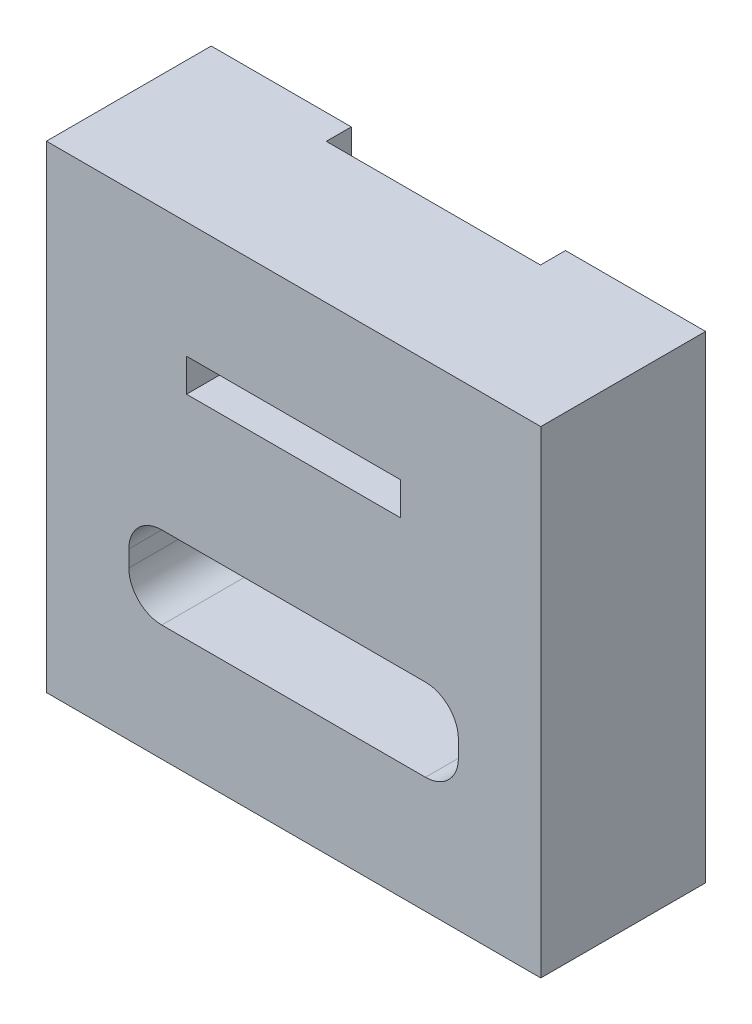
ISO-10303-21;
HEADER;
FILE_DESCRIPTION(('STEP AP214'),'2;1');
FILE_NAME('part.step','',(''),(''),'','','');
FILE_SCHEMA(('AUTOMOTIVE_DESIGN { 1 0 10303 214 1 1 1 1 }'));
ENDSEC;
DATA;
#1=APPLICATION_CONTEXT('core data for automotive mechanical design processes');
#2=APPLICATION_PROTOCOL_DEFINITION('international standard','automotive_design',2000,#1);
#3=PRODUCT_CONTEXT('',#1,'mechanical');
#4=PRODUCT('Part','Part','',(#3));
#5=PRODUCT_RELATED_PRODUCT_CATEGORY('part','',(#4));
#6=PRODUCT_DEFINITION_FORMATION('','',#4);
#7=PRODUCT_DEFINITION_CONTEXT('part definition',#1,'design');
#8=PRODUCT_DEFINITION('design','',#6,#7);
#9=PRODUCT_DEFINITION_SHAPE('','',#8);
#10=(LENGTH_UNIT() NAMED_UNIT(*) SI_UNIT(.MILLI.,.METRE.));
#11=(NAMED_UNIT(*) PLANE_ANGLE_UNIT() SI_UNIT($,.RADIAN.));
#12=(NAMED_UNIT(*) SI_UNIT($,.STERADIAN.) SOLID_ANGLE_UNIT());
#13=UNCERTAINTY_MEASURE_WITH_UNIT(LENGTH_MEASURE(1.E-05),#10,'distance_accuracy_value','');
#14=(GEOMETRIC_REPRESENTATION_CONTEXT(3) GLOBAL_UNCERTAINTY_ASSIGNED_CONTEXT((#13)) GLOBAL_UNIT_ASSIGNED_CONTEXT((#10,
#11,#12)) REPRESENTATION_CONTEXT('',''));
#15=CARTESIAN_POINT('',(0.,0.,0.));
#16=DIRECTION('',(0.,0.,1.));
#17=DIRECTION('',(1.,0.,0.));
#18=AXIS2_PLACEMENT_3D('',#15,#16,#17);
#19=CARTESIAN_POINT('',(0.,0.,10.));
#20=DIRECTION('',(0.,0.,1.));
#21=DIRECTION('',(1.,0.,0.));
#22=AXIS2_PLACEMENT_3D('',#19,#20,#21);
#23=PLANE('',#22);
#24=DIRECTION('',(0.,1.,0.));
#25=VECTOR('',#24,1.);
#26=CARTESIAN_POINT('',(18.3,-72.07,10.));
#27=LINE('',#26,#25);
#28=CARTESIAN_POINT('',(18.3,-101.05,10.));
#29=VERTEX_POINT('',#28);
#30=CARTESIAN_POINT('',(18.3,-72.07,10.));
#31=VERTEX_POINT('',#30);
#32=EDGE_CURVE('E244',#29,#31,#27,.T.);
#33=ORIENTED_EDGE('',*,*,#32,.T.);
#34=DIRECTION('',(-1.,0.,0.));
#35=VECTOR('',#34,1.);
#36=CARTESIAN_POINT('',(-11.7,-72.07,10.));
#37=LINE('',#36,#35);
#38=CARTESIAN_POINT('',(-11.7,-72.07,10.));
#39=VERTEX_POINT('',#38);
#40=EDGE_CURVE('E247',#31,#39,#37,.T.);
#41=ORIENTED_EDGE('',*,*,#40,.T.);
#42=DIRECTION('',(0.,-1.,0.));
#43=VECTOR('',#42,1.);
#44=CARTESIAN_POINT('',(-11.7,-72.07,10.));
#45=LINE('',#44,#43);
#46=CARTESIAN_POINT('',(-11.7,-101.05,10.));
#47=VERTEX_POINT('',#46);
#48=EDGE_CURVE('E250',#39,#47,#45,.T.);
#49=ORIENTED_EDGE('',*,*,#48,.T.);
#50=DIRECTION('',(1.,0.,0.));
#51=VECTOR('',#50,1.);
#52=CARTESIAN_POINT('',(-11.7,-101.05,10.));
#53=LINE('',#52,#51);
#54=EDGE_CURVE('E252',#47,#29,#53,.T.);
#55=ORIENTED_EDGE('',*,*,#54,.T.);
#56=EDGE_LOOP('',(#33,#41,#49,#55));
#57=FACE_BOUND('',#56,.T.);
#58=DIRECTION('',(0.,1.,0.));
#59=VECTOR('',#58,1.);
#60=CARTESIAN_POINT('',(9.80000000000001,-79.12,10.));
#61=LINE('',#60,#59);
#62=CARTESIAN_POINT('',(9.80000000000001,-81.12,10.));
#63=VERTEX_POINT('',#62);
#64=CARTESIAN_POINT('',(9.80000000000001,-79.12,10.));
#65=VERTEX_POINT('',#64);
#66=EDGE_CURVE('E222',#63,#65,#61,.T.);
#67=ORIENTED_EDGE('',*,*,#66,.F.);
#68=DIRECTION('',(1.,0.,0.));
#69=VECTOR('',#68,1.);
#70=CARTESIAN_POINT('',(9.80000000000001,-81.12,10.));
#71=LINE('',#70,#69);
#72=CARTESIAN_POINT('',(-3.19999999999999,-81.12,10.));
#73=VERTEX_POINT('',#72);
#74=EDGE_CURVE('E220',#73,#63,#71,.T.);
#75=ORIENTED_EDGE('',*,*,#74,.F.);
#76=DIRECTION('',(0.,-1.,0.));
#77=VECTOR('',#76,1.);
#78=CARTESIAN_POINT('',(-3.19999999999999,-81.12,10.));
#79=LINE('',#78,#77);
#80=CARTESIAN_POINT('',(-3.19999999999999,-79.12,10.));
#81=VERTEX_POINT('',#80);
#82=EDGE_CURVE('E227',#81,#73,#79,.T.);
#83=ORIENTED_EDGE('',*,*,#82,.F.);
#84=DIRECTION('',(-1.,0.,0.));
#85=VECTOR('',#84,1.);
#86=CARTESIAN_POINT('',(-3.19999999999999,-79.12,10.));
#87=LINE('',#86,#85);
#88=EDGE_CURVE('E224',#65,#81,#87,.T.);
#89=ORIENTED_EDGE('',*,*,#88,.F.);
#90=EDGE_LOOP('',(#67,#75,#83,#89));
#91=FACE_BOUND('',#90,.T.);
#92=DIRECTION('',(1.,0.,0.));
#93=VECTOR('',#92,1.);
#94=CARTESIAN_POINT('',(13.3,-94.,10.));
#95=LINE('',#94,#93);
#96=CARTESIAN_POINT('',(-4.69999999999999,-94.,10.));
#97=VERTEX_POINT('',#96);
#98=CARTESIAN_POINT('',(11.3,-94.,10.));
#99=VERTEX_POINT('',#98);
#100=EDGE_CURVE('E199',#97,#99,#95,.T.);
#101=ORIENTED_EDGE('',*,*,#100,.F.);
#102=CARTESIAN_POINT('',(-4.69999999999999,-92.,10.));
#103=DIRECTION('',(0.,0.,1.));
#104=DIRECTION('',(1.,0.,0.));
#105=AXIS2_PLACEMENT_3D('',#102,#103,#104);
#106=CIRCLE('',#105,2.);
#107=CARTESIAN_POINT('',(-6.69999999999999,-92.,10.));
#108=VERTEX_POINT('',#107);
#109=EDGE_CURVE('E308',#97,#108,#106,.F.);
#110=ORIENTED_EDGE('',*,*,#109,.T.);
#111=DIRECTION('',(0.,-1.,0.));
#112=VECTOR('',#111,1.);
#113=CARTESIAN_POINT('',(-6.69999999999999,-94.,10.));
#114=LINE('',#113,#112);
#115=CARTESIAN_POINT('',(-6.69999999999999,-91.,10.));
#116=VERTEX_POINT('',#115);
#117=EDGE_CURVE('E196',#116,#108,#114,.T.);
#118=ORIENTED_EDGE('',*,*,#117,.F.);
#119=CARTESIAN_POINT('',(-4.69999999999999,-91.,10.));
#120=DIRECTION('',(0.,0.,1.));
#121=DIRECTION('',(1.,0.,0.));
#122=AXIS2_PLACEMENT_3D('',#119,#120,#121);
#123=CIRCLE('',#122,2.);
#124=CARTESIAN_POINT('',(-4.69999999999999,-89.,10.));
#125=VERTEX_POINT('',#124);
#126=EDGE_CURVE('E304',#116,#125,#123,.F.);
#127=ORIENTED_EDGE('',*,*,#126,.T.);
#128=DIRECTION('',(-1.,0.,0.));
#129=VECTOR('',#128,1.);
#130=CARTESIAN_POINT('',(13.3,-89.,10.));
#131=LINE('',#130,#129);
#132=CARTESIAN_POINT('',(11.3,-89.,10.));
#133=VERTEX_POINT('',#132);
#134=EDGE_CURVE('E206',#133,#125,#131,.T.);
#135=ORIENTED_EDGE('',*,*,#134,.F.);
#136=CARTESIAN_POINT('',(11.3,-91.,10.));
#137=DIRECTION('',(0.,0.,1.));
#138=DIRECTION('',(1.,0.,0.));
#139=AXIS2_PLACEMENT_3D('',#136,#137,#138);
#140=CIRCLE('',#139,2.);
#141=CARTESIAN_POINT('',(13.3,-91.,10.));
#142=VERTEX_POINT('',#141);
#143=EDGE_CURVE('E300',#133,#142,#140,.F.);
#144=ORIENTED_EDGE('',*,*,#143,.T.);
#145=DIRECTION('',(0.,1.,0.));
#146=VECTOR('',#145,1.);
#147=CARTESIAN_POINT('',(13.3,-94.,10.));
#148=LINE('',#147,#146);
#149=CARTESIAN_POINT('',(13.3,-92.,10.));
#150=VERTEX_POINT('',#149);
#151=EDGE_CURVE('E203',#150,#142,#148,.T.);
#152=ORIENTED_EDGE('',*,*,#151,.F.);
#153=CARTESIAN_POINT('',(11.3,-92.,10.));
#154=DIRECTION('',(0.,0.,1.));
#155=DIRECTION('',(1.,0.,0.));
#156=AXIS2_PLACEMENT_3D('',#153,#154,#155);
#157=CIRCLE('',#156,2.);
#158=EDGE_CURVE('E296',#150,#99,#157,.F.);
#159=ORIENTED_EDGE('',*,*,#158,.T.);
#160=EDGE_LOOP('',(#101,#110,#118,#127,#135,#144,#152,#159));
#161=FACE_BOUND('',#160,.T.);
#162=ADVANCED_FACE('F37',(#57,#91,#161),#23,.T.);
#163=CARTESIAN_POINT('',(0.,0.,0.));
#164=DIRECTION('',(0.,0.,1.));
#165=DIRECTION('',(1.,0.,0.));
#166=AXIS2_PLACEMENT_3D('',#163,#164,#165);
#167=PLANE('',#166);
#168=DIRECTION('',(0.,1.,0.));
#169=VECTOR('',#168,1.);
#170=CARTESIAN_POINT('',(9.80000000000001,-79.12,0.));
#171=LINE('',#170,#169);
#172=CARTESIAN_POINT('',(9.80000000000001,-81.12,0.));
#173=VERTEX_POINT('',#172);
#174=CARTESIAN_POINT('',(9.80000000000001,-72.07,0.));
#175=VERTEX_POINT('',#174);
#176=EDGE_CURVE('E232',#173,#175,#171,.T.);
#177=ORIENTED_EDGE('',*,*,#176,.T.);
#178=DIRECTION('',(-1.,0.,0.));
#179=VECTOR('',#178,1.);
#180=CARTESIAN_POINT('',(-11.7,-72.07,0.));
#181=LINE('',#180,#179);
#182=CARTESIAN_POINT('',(18.3,-72.07,0.));
#183=VERTEX_POINT('',#182);
#184=EDGE_CURVE('E258',#183,#175,#181,.T.);
#185=ORIENTED_EDGE('',*,*,#184,.F.);
#186=DIRECTION('',(0.,1.,0.));
#187=VECTOR('',#186,1.);
#188=CARTESIAN_POINT('',(18.3,-72.07,0.));
#189=LINE('',#188,#187);
#190=CARTESIAN_POINT('',(18.3,-101.05,0.));
#191=VERTEX_POINT('',#190);
#192=EDGE_CURVE('E243',#191,#183,#189,.T.);
#193=ORIENTED_EDGE('',*,*,#192,.F.);
#194=DIRECTION('',(1.,0.,0.));
#195=VECTOR('',#194,1.);
#196=CARTESIAN_POINT('',(-11.7,-101.05,0.));
#197=LINE('',#196,#195);
#198=CARTESIAN_POINT('',(-11.7,-101.05,0.));
#199=VERTEX_POINT('',#198);
#200=EDGE_CURVE('E248',#199,#191,#197,.T.);
#201=ORIENTED_EDGE('',*,*,#200,.F.);
#202=DIRECTION('',(0.,-1.,0.));
#203=VECTOR('',#202,1.);
#204=CARTESIAN_POINT('',(-11.7,-72.07,0.));
#205=LINE('',#204,#203);
#206=CARTESIAN_POINT('',(-11.7,-72.07,0.));
#207=VERTEX_POINT('',#206);
#208=EDGE_CURVE('E260',#207,#199,#205,.T.);
#209=ORIENTED_EDGE('',*,*,#208,.F.);
#210=CARTESIAN_POINT('',(-3.19999999999999,-72.07,0.));
#211=VERTEX_POINT('',#210);
#212=EDGE_CURVE('E257',#211,#207,#181,.T.);
#213=ORIENTED_EDGE('',*,*,#212,.F.);
#214=DIRECTION('',(0.,-1.,0.));
#215=VECTOR('',#214,1.);
#216=CARTESIAN_POINT('',(-3.19999999999999,-81.12,0.));
#217=LINE('',#216,#215);
#218=CARTESIAN_POINT('',(-3.19999999999999,-81.12,0.));
#219=VERTEX_POINT('',#218);
#220=EDGE_CURVE('E183',#211,#219,#217,.T.);
#221=ORIENTED_EDGE('',*,*,#220,.T.);
#222=DIRECTION('',(1.,0.,0.));
#223=VECTOR('',#222,1.);
#224=CARTESIAN_POINT('',(9.80000000000001,-81.12,0.));
#225=LINE('',#224,#223);
#226=EDGE_CURVE('E209',#219,#173,#225,.T.);
#227=ORIENTED_EDGE('',*,*,#226,.T.);
#228=EDGE_LOOP('',(#177,#185,#193,#201,#209,#213,#221,#227));
#229=FACE_BOUND('',#228,.T.);
#230=DIRECTION('',(-1.,0.,0.));
#231=VECTOR('',#230,1.);
#232=CARTESIAN_POINT('',(13.3,-89.,0.));
#233=LINE('',#232,#231);
#234=CARTESIAN_POINT('',(11.3,-89.,0.));
#235=VERTEX_POINT('',#234);
#236=CARTESIAN_POINT('',(-4.69999999999999,-89.,0.));
#237=VERTEX_POINT('',#236);
#238=EDGE_CURVE('E200',#235,#237,#233,.T.);
#239=ORIENTED_EDGE('',*,*,#238,.T.);
#240=CARTESIAN_POINT('',(-4.69999999999999,-91.,0.));
#241=DIRECTION('',(0.,0.,1.));
#242=DIRECTION('',(1.,0.,0.));
#243=AXIS2_PLACEMENT_3D('',#240,#241,#242);
#244=CIRCLE('',#243,2.);
#245=CARTESIAN_POINT('',(-6.69999999999999,-91.,0.));
#246=VERTEX_POINT('',#245);
#247=EDGE_CURVE('E302',#237,#246,#244,.T.);
#248=ORIENTED_EDGE('',*,*,#247,.T.);
#249=DIRECTION('',(0.,-1.,0.));
#250=VECTOR('',#249,1.);
#251=CARTESIAN_POINT('',(-6.69999999999999,-94.,0.));
#252=LINE('',#251,#250);
#253=CARTESIAN_POINT('',(-6.69999999999999,-92.,0.));
#254=VERTEX_POINT('',#253);
#255=EDGE_CURVE('E194',#246,#254,#252,.T.);
#256=ORIENTED_EDGE('',*,*,#255,.T.);
#257=CARTESIAN_POINT('',(-4.69999999999999,-92.,0.));
#258=DIRECTION('',(0.,0.,1.));
#259=DIRECTION('',(1.,0.,0.));
#260=AXIS2_PLACEMENT_3D('',#257,#258,#259);
#261=CIRCLE('',#260,2.);
#262=CARTESIAN_POINT('',(-4.69999999999999,-94.,0.));
#263=VERTEX_POINT('',#262);
#264=EDGE_CURVE('E306',#254,#263,#261,.T.);
#265=ORIENTED_EDGE('',*,*,#264,.T.);
#266=DIRECTION('',(1.,0.,0.));
#267=VECTOR('',#266,1.);
#268=CARTESIAN_POINT('',(13.3,-94.,0.));
#269=LINE('',#268,#267);
#270=CARTESIAN_POINT('',(11.3,-94.,0.));
#271=VERTEX_POINT('',#270);
#272=EDGE_CURVE('E212',#263,#271,#269,.T.);
#273=ORIENTED_EDGE('',*,*,#272,.T.);
#274=CARTESIAN_POINT('',(11.3,-92.,0.));
#275=DIRECTION('',(0.,0.,1.));
#276=DIRECTION('',(1.,0.,0.));
#277=AXIS2_PLACEMENT_3D('',#274,#275,#276);
#278=CIRCLE('',#277,2.);
#279=CARTESIAN_POINT('',(13.3,-92.,0.));
#280=VERTEX_POINT('',#279);
#281=EDGE_CURVE('E294',#271,#280,#278,.T.);
#282=ORIENTED_EDGE('',*,*,#281,.T.);
#283=DIRECTION('',(0.,1.,0.));
#284=VECTOR('',#283,1.);
#285=CARTESIAN_POINT('',(13.3,-94.,0.));
#286=LINE('',#285,#284);
#287=CARTESIAN_POINT('',(13.3,-91.,0.));
#288=VERTEX_POINT('',#287);
#289=EDGE_CURVE('E215',#280,#288,#286,.T.);
#290=ORIENTED_EDGE('',*,*,#289,.T.);
#291=CARTESIAN_POINT('',(11.3,-91.,0.));
#292=DIRECTION('',(0.,0.,1.));
#293=DIRECTION('',(1.,0.,0.));
#294=AXIS2_PLACEMENT_3D('',#291,#292,#293);
#295=CIRCLE('',#294,2.);
#296=EDGE_CURVE('E298',#288,#235,#295,.T.);
#297=ORIENTED_EDGE('',*,*,#296,.T.);
#298=EDGE_LOOP('',(#239,#248,#256,#265,#273,#282,#290,#297));
#299=FACE_BOUND('',#298,.T.);
#300=ADVANCED_FACE('F326',(#229,#299),#167,.F.);
#301=CARTESIAN_POINT('',(18.3,-72.07,10.));
#302=DIRECTION('',(-1.,0.,0.));
#303=DIRECTION('',(0.,0.,1.));
#304=AXIS2_PLACEMENT_3D('',#301,#302,#303);
#305=PLANE('',#304);
#306=ORIENTED_EDGE('',*,*,#192,.T.);
#307=DIRECTION('',(0.,0.,-1.));
#308=VECTOR('',#307,1.);
#309=CARTESIAN_POINT('',(18.3,-72.07,10.));
#310=LINE('',#309,#308);
#311=EDGE_CURVE('E271',#31,#183,#310,.T.);
#312=ORIENTED_EDGE('',*,*,#311,.F.);
#313=ORIENTED_EDGE('',*,*,#32,.F.);
#314=DIRECTION('',(0.,0.,-1.));
#315=VECTOR('',#314,1.);
#316=CARTESIAN_POINT('',(18.3,-101.05,10.));
#317=LINE('',#316,#315);
#318=EDGE_CURVE('E254',#29,#191,#317,.T.);
#319=ORIENTED_EDGE('',*,*,#318,.T.);
#320=EDGE_LOOP('',(#306,#312,#313,#319));
#321=FACE_BOUND('',#320,.T.);
#322=ADVANCED_FACE('F363',(#321),#305,.F.);
#323=CARTESIAN_POINT('',(-11.7,-72.07,10.));
#324=DIRECTION('',(0.,-1.,0.));
#325=DIRECTION('',(0.,0.,-1.));
#326=AXIS2_PLACEMENT_3D('',#323,#324,#325);
#327=PLANE('',#326);
#328=ORIENTED_EDGE('',*,*,#184,.T.);
#329=DIRECTION('',(0.,0.,-1.));
#330=VECTOR('',#329,1.);
#331=CARTESIAN_POINT('',(9.80000000000001,-72.07,1.52));
#332=LINE('',#331,#330);
#333=CARTESIAN_POINT('',(9.80000000000001,-72.07,1.52));
#334=VERTEX_POINT('',#333);
#335=EDGE_CURVE('E186',#334,#175,#332,.T.);
#336=ORIENTED_EDGE('',*,*,#335,.F.);
#337=DIRECTION('',(1.,0.,0.));
#338=VECTOR('',#337,1.);
#339=CARTESIAN_POINT('',(9.80000000000001,-72.07,1.52));
#340=LINE('',#339,#338);
#341=CARTESIAN_POINT('',(-3.19999999999999,-72.07,1.52));
#342=VERTEX_POINT('',#341);
#343=EDGE_CURVE('E172',#342,#334,#340,.T.);
#344=ORIENTED_EDGE('',*,*,#343,.F.);
#345=DIRECTION('',(0.,0.,-1.));
#346=VECTOR('',#345,1.);
#347=CARTESIAN_POINT('',(-3.19999999999999,-72.07,1.52));
#348=LINE('',#347,#346);
#349=EDGE_CURVE('E179',#342,#211,#348,.T.);
#350=ORIENTED_EDGE('',*,*,#349,.T.);
#351=ORIENTED_EDGE('',*,*,#212,.T.);
#352=DIRECTION('',(0.,0.,-1.));
#353=VECTOR('',#352,1.);
#354=CARTESIAN_POINT('',(-11.7,-72.07,10.));
#355=LINE('',#354,#353);
#356=EDGE_CURVE('E268',#39,#207,#355,.T.);
#357=ORIENTED_EDGE('',*,*,#356,.F.);
#358=ORIENTED_EDGE('',*,*,#40,.F.);
#359=ORIENTED_EDGE('',*,*,#311,.T.);
#360=EDGE_LOOP('',(#328,#336,#344,#350,#351,#357,#358,#359));
#361=FACE_BOUND('',#360,.T.);
#362=ADVANCED_FACE('F189',(#361),#327,.F.);
#363=CARTESIAN_POINT('',(-11.7,-72.07,10.));
#364=DIRECTION('',(1.,0.,0.));
#365=DIRECTION('',(0.,1.,0.));
#366=AXIS2_PLACEMENT_3D('',#363,#364,#365);
#367=PLANE('',#366);
#368=ORIENTED_EDGE('',*,*,#208,.T.);
#369=DIRECTION('',(0.,0.,-1.));
#370=VECTOR('',#369,1.);
#371=CARTESIAN_POINT('',(-11.7,-101.05,10.));
#372=LINE('',#371,#370);
#373=EDGE_CURVE('E265',#47,#199,#372,.T.);
#374=ORIENTED_EDGE('',*,*,#373,.F.);
#375=ORIENTED_EDGE('',*,*,#48,.F.);
#376=ORIENTED_EDGE('',*,*,#356,.T.);
#377=EDGE_LOOP('',(#368,#374,#375,#376));
#378=FACE_BOUND('',#377,.T.);
#379=ADVANCED_FACE('F374',(#378),#367,.F.);
#380=CARTESIAN_POINT('',(-11.7,-101.05,10.));
#381=DIRECTION('',(0.,1.,0.));
#382=DIRECTION('',(-1.,0.,0.));
#383=AXIS2_PLACEMENT_3D('',#380,#381,#382);
#384=PLANE('',#383);
#385=ORIENTED_EDGE('',*,*,#200,.T.);
#386=ORIENTED_EDGE('',*,*,#318,.F.);
#387=ORIENTED_EDGE('',*,*,#54,.F.);
#388=ORIENTED_EDGE('',*,*,#373,.T.);
#389=EDGE_LOOP('',(#385,#386,#387,#388));
#390=FACE_BOUND('',#389,.T.);
#391=ADVANCED_FACE('F371',(#390),#384,.F.);
#392=CARTESIAN_POINT('',(9.80000000000001,-81.12,10.));
#393=DIRECTION('',(0.,1.,0.));
#394=DIRECTION('',(0.,0.,1.));
#395=AXIS2_PLACEMENT_3D('',#392,#393,#394);
#396=PLANE('',#395);
#397=ORIENTED_EDGE('',*,*,#226,.F.);
#398=DIRECTION('',(0.,0.,-1.));
#399=VECTOR('',#398,1.);
#400=CARTESIAN_POINT('',(-3.19999999999999,-81.12,10.));
#401=LINE('',#400,#399);
#402=EDGE_CURVE('E229',#73,#219,#401,.T.);
#403=ORIENTED_EDGE('',*,*,#402,.F.);
#404=ORIENTED_EDGE('',*,*,#74,.T.);
#405=DIRECTION('',(0.,0.,-1.));
#406=VECTOR('',#405,1.);
#407=CARTESIAN_POINT('',(9.80000000000001,-81.12,10.));
#408=LINE('',#407,#406);
#409=EDGE_CURVE('E240',#63,#173,#408,.T.);
#410=ORIENTED_EDGE('',*,*,#409,.T.);
#411=EDGE_LOOP('',(#397,#403,#404,#410));
#412=FACE_BOUND('',#411,.T.);
#413=ADVANCED_FACE('F368',(#412),#396,.T.);
#414=CARTESIAN_POINT('',(9.80000000000001,-79.12,10.));
#415=DIRECTION('',(-1.,0.,0.));
#416=DIRECTION('',(0.,-1.,0.));
#417=AXIS2_PLACEMENT_3D('',#414,#415,#416);
#418=PLANE('',#417);
#419=ORIENTED_EDGE('',*,*,#176,.F.);
#420=ORIENTED_EDGE('',*,*,#409,.F.);
#421=ORIENTED_EDGE('',*,*,#66,.T.);
#422=DIRECTION('',(0.,0.,-1.));
#423=VECTOR('',#422,1.);
#424=CARTESIAN_POINT('',(9.80000000000001,-79.12,10.));
#425=LINE('',#424,#423);
#426=CARTESIAN_POINT('',(9.80000000000001,-79.12,3.52));
#427=VERTEX_POINT('',#426);
#428=EDGE_CURVE('E238',#65,#427,#425,.T.);
#429=ORIENTED_EDGE('',*,*,#428,.T.);
#430=CARTESIAN_POINT('',(9.80000000000001,-77.12,3.52));
#431=DIRECTION('',(-1.,0.,0.));
#432=DIRECTION('',(0.,-1.,0.));
#433=AXIS2_PLACEMENT_3D('',#430,#431,#432);
#434=CIRCLE('',#433,2.);
#435=CARTESIAN_POINT('',(9.80000000000001,-77.12,1.52));
#436=VERTEX_POINT('',#435);
#437=EDGE_CURVE('E11',#427,#436,#434,.F.);
#438=ORIENTED_EDGE('',*,*,#437,.T.);
#439=DIRECTION('',(0.,-1.,0.));
#440=VECTOR('',#439,1.);
#441=CARTESIAN_POINT('',(9.80000000000001,-79.12,1.52));
#442=LINE('',#441,#440);
#443=EDGE_CURVE('E176',#334,#436,#442,.T.);
#444=ORIENTED_EDGE('',*,*,#443,.F.);
#445=ORIENTED_EDGE('',*,*,#335,.T.);
#446=EDGE_LOOP('',(#419,#420,#421,#429,#438,#444,#445));
#447=FACE_BOUND('',#446,.T.);
#448=ADVANCED_FACE('F403',(#447),#418,.T.);
#449=CARTESIAN_POINT('',(-3.19999999999999,-79.12,10.));
#450=DIRECTION('',(0.,-1.,0.));
#451=DIRECTION('',(0.,0.,-1.));
#452=AXIS2_PLACEMENT_3D('',#449,#450,#451);
#453=PLANE('',#452);
#454=DIRECTION('',(0.,0.,-1.));
#455=VECTOR('',#454,1.);
#456=CARTESIAN_POINT('',(-3.19999999999999,-79.12,10.));
#457=LINE('',#456,#455);
#458=CARTESIAN_POINT('',(-3.19999999999999,-79.12,3.52));
#459=VERTEX_POINT('',#458);
#460=EDGE_CURVE('E236',#81,#459,#457,.T.);
#461=ORIENTED_EDGE('',*,*,#460,.T.);
#462=DIRECTION('',(-1.,0.,0.));
#463=VECTOR('',#462,1.);
#464=CARTESIAN_POINT('',(9.80000000000001,-79.12,3.52));
#465=LINE('',#464,#463);
#466=EDGE_CURVE('E58',#459,#427,#465,.F.);
#467=ORIENTED_EDGE('',*,*,#466,.T.);
#468=ORIENTED_EDGE('',*,*,#428,.F.);
#469=ORIENTED_EDGE('',*,*,#88,.T.);
#470=EDGE_LOOP('',(#461,#467,#468,#469));
#471=FACE_BOUND('',#470,.T.);
#472=ADVANCED_FACE('F401',(#471),#453,.T.);
#473=CARTESIAN_POINT('',(-3.19999999999999,-81.12,10.));
#474=DIRECTION('',(1.,0.,0.));
#475=DIRECTION('',(0.,1.,0.));
#476=AXIS2_PLACEMENT_3D('',#473,#474,#475);
#477=PLANE('',#476);
#478=ORIENTED_EDGE('',*,*,#220,.F.);
#479=ORIENTED_EDGE('',*,*,#349,.F.);
#480=DIRECTION('',(0.,1.,0.));
#481=VECTOR('',#480,1.);
#482=CARTESIAN_POINT('',(-3.19999999999999,-79.12,1.52));
#483=LINE('',#482,#481);
#484=CARTESIAN_POINT('',(-3.19999999999999,-77.12,1.52));
#485=VERTEX_POINT('',#484);
#486=EDGE_CURVE('E167',#485,#342,#483,.T.);
#487=ORIENTED_EDGE('',*,*,#486,.F.);
#488=CARTESIAN_POINT('',(-3.19999999999999,-77.12,3.52));
#489=DIRECTION('',(1.,0.,0.));
#490=DIRECTION('',(0.,1.,0.));
#491=AXIS2_PLACEMENT_3D('',#488,#489,#490);
#492=CIRCLE('',#491,2.);
#493=EDGE_CURVE('E45',#485,#459,#492,.F.);
#494=ORIENTED_EDGE('',*,*,#493,.T.);
#495=ORIENTED_EDGE('',*,*,#460,.F.);
#496=ORIENTED_EDGE('',*,*,#82,.T.);
#497=ORIENTED_EDGE('',*,*,#402,.T.);
#498=EDGE_LOOP('',(#478,#479,#487,#494,#495,#496,#497));
#499=FACE_BOUND('',#498,.T.);
#500=ADVANCED_FACE('F180',(#499),#477,.T.);
#501=CARTESIAN_POINT('',(-6.69999999999999,-94.,10.));
#502=DIRECTION('',(1.,0.,0.));
#503=DIRECTION('',(0.,0.,-1.));
#504=AXIS2_PLACEMENT_3D('',#501,#502,#503);
#505=PLANE('',#504);
#506=ORIENTED_EDGE('',*,*,#255,.F.);
#507=DIRECTION('',(0.,0.,-1.));
#508=VECTOR('',#507,1.);
#509=CARTESIAN_POINT('',(-6.69999999999999,-91.,10.));
#510=LINE('',#509,#508);
#511=EDGE_CURVE('E292',#246,#116,#510,.F.);
#512=ORIENTED_EDGE('',*,*,#511,.T.);
#513=ORIENTED_EDGE('',*,*,#117,.T.);
#514=DIRECTION('',(0.,0.,-1.));
#515=VECTOR('',#514,1.);
#516=CARTESIAN_POINT('',(-6.69999999999999,-92.,0.));
#517=LINE('',#516,#515);
#518=EDGE_CURVE('E289',#108,#254,#517,.T.);
#519=ORIENTED_EDGE('',*,*,#518,.T.);
#520=EDGE_LOOP('',(#506,#512,#513,#519));
#521=FACE_BOUND('',#520,.T.);
#522=ADVANCED_FACE('F321',(#521),#505,.T.);
#523=CARTESIAN_POINT('',(13.3,-94.,10.));
#524=DIRECTION('',(0.,1.,0.));
#525=DIRECTION('',(0.,0.,1.));
#526=AXIS2_PLACEMENT_3D('',#523,#524,#525);
#527=PLANE('',#526);
#528=ORIENTED_EDGE('',*,*,#100,.T.);
#529=DIRECTION('',(0.,0.,-1.));
#530=VECTOR('',#529,1.);
#531=CARTESIAN_POINT('',(11.3,-94.,0.));
#532=LINE('',#531,#530);
#533=EDGE_CURVE('E276',#99,#271,#532,.T.);
#534=ORIENTED_EDGE('',*,*,#533,.T.);
#535=ORIENTED_EDGE('',*,*,#272,.F.);
#536=DIRECTION('',(0.,0.,-1.));
#537=VECTOR('',#536,1.);
#538=CARTESIAN_POINT('',(-4.69999999999999,-94.,10.));
#539=LINE('',#538,#537);
#540=EDGE_CURVE('E274',#263,#97,#539,.F.);
#541=ORIENTED_EDGE('',*,*,#540,.T.);
#542=EDGE_LOOP('',(#528,#534,#535,#541));
#543=FACE_BOUND('',#542,.T.);
#544=ADVANCED_FACE('F328',(#543),#527,.T.);
#545=CARTESIAN_POINT('',(13.3,-94.,10.));
#546=DIRECTION('',(-1.,0.,0.));
#547=DIRECTION('',(0.,0.,1.));
#548=AXIS2_PLACEMENT_3D('',#545,#546,#547);
#549=PLANE('',#548);
#550=ORIENTED_EDGE('',*,*,#289,.F.);
#551=DIRECTION('',(0.,0.,-1.));
#552=VECTOR('',#551,1.);
#553=CARTESIAN_POINT('',(13.3,-92.,10.));
#554=LINE('',#553,#552);
#555=EDGE_CURVE('E282',#280,#150,#554,.F.);
#556=ORIENTED_EDGE('',*,*,#555,.T.);
#557=ORIENTED_EDGE('',*,*,#151,.T.);
#558=DIRECTION('',(0.,0.,-1.));
#559=VECTOR('',#558,1.);
#560=CARTESIAN_POINT('',(13.3,-91.,0.));
#561=LINE('',#560,#559);
#562=EDGE_CURVE('E279',#142,#288,#561,.T.);
#563=ORIENTED_EDGE('',*,*,#562,.T.);
#564=EDGE_LOOP('',(#550,#556,#557,#563));
#565=FACE_BOUND('',#564,.T.);
#566=ADVANCED_FACE('F336',(#565),#549,.T.);
#567=CARTESIAN_POINT('',(13.3,-89.,10.));
#568=DIRECTION('',(0.,-1.,0.));
#569=DIRECTION('',(0.,0.,-1.));
#570=AXIS2_PLACEMENT_3D('',#567,#568,#569);
#571=PLANE('',#570);
#572=ORIENTED_EDGE('',*,*,#238,.F.);
#573=DIRECTION('',(0.,0.,-1.));
#574=VECTOR('',#573,1.);
#575=CARTESIAN_POINT('',(11.3,-89.,10.));
#576=LINE('',#575,#574);
#577=EDGE_CURVE('E287',#235,#133,#576,.F.);
#578=ORIENTED_EDGE('',*,*,#577,.T.);
#579=ORIENTED_EDGE('',*,*,#134,.T.);
#580=DIRECTION('',(0.,0.,-1.));
#581=VECTOR('',#580,1.);
#582=CARTESIAN_POINT('',(-4.69999999999999,-89.,0.));
#583=LINE('',#582,#581);
#584=EDGE_CURVE('E284',#125,#237,#583,.T.);
#585=ORIENTED_EDGE('',*,*,#584,.T.);
#586=EDGE_LOOP('',(#572,#578,#579,#585));
#587=FACE_BOUND('',#586,.T.);
#588=ADVANCED_FACE('F345',(#587),#571,.T.);
#589=CARTESIAN_POINT('',(11.3,-92.,10.));
#590=DIRECTION('',(0.,0.,1.));
#591=DIRECTION('',(1.,0.,0.));
#592=AXIS2_PLACEMENT_3D('',#589,#590,#591);
#593=CYLINDRICAL_SURFACE('',#592,2.);
#594=ORIENTED_EDGE('',*,*,#158,.F.);
#595=ORIENTED_EDGE('',*,*,#555,.F.);
#596=ORIENTED_EDGE('',*,*,#281,.F.);
#597=ORIENTED_EDGE('',*,*,#533,.F.);
#598=EDGE_LOOP('',(#594,#595,#596,#597));
#599=FACE_BOUND('',#598,.T.);
#600=ADVANCED_FACE('F332',(#599),#593,.F.);
#601=CARTESIAN_POINT('',(11.3,-91.,10.));
#602=DIRECTION('',(0.,0.,1.));
#603=DIRECTION('',(1.,0.,0.));
#604=AXIS2_PLACEMENT_3D('',#601,#602,#603);
#605=CYLINDRICAL_SURFACE('',#604,2.);
#606=ORIENTED_EDGE('',*,*,#143,.F.);
#607=ORIENTED_EDGE('',*,*,#577,.F.);
#608=ORIENTED_EDGE('',*,*,#296,.F.);
#609=ORIENTED_EDGE('',*,*,#562,.F.);
#610=EDGE_LOOP('',(#606,#607,#608,#609));
#611=FACE_BOUND('',#610,.T.);
#612=ADVANCED_FACE('F341',(#611),#605,.F.);
#613=CARTESIAN_POINT('',(-4.69999999999999,-91.,10.));
#614=DIRECTION('',(0.,0.,1.));
#615=DIRECTION('',(1.,0.,0.));
#616=AXIS2_PLACEMENT_3D('',#613,#614,#615);
#617=CYLINDRICAL_SURFACE('',#616,2.);
#618=ORIENTED_EDGE('',*,*,#126,.F.);
#619=ORIENTED_EDGE('',*,*,#511,.F.);
#620=ORIENTED_EDGE('',*,*,#247,.F.);
#621=ORIENTED_EDGE('',*,*,#584,.F.);
#622=EDGE_LOOP('',(#618,#619,#620,#621));
#623=FACE_BOUND('',#622,.T.);
#624=ADVANCED_FACE('F349',(#623),#617,.F.);
#625=CARTESIAN_POINT('',(-4.69999999999999,-92.,10.));
#626=DIRECTION('',(0.,0.,1.));
#627=DIRECTION('',(1.,0.,0.));
#628=AXIS2_PLACEMENT_3D('',#625,#626,#627);
#629=CYLINDRICAL_SURFACE('',#628,2.);
#630=ORIENTED_EDGE('',*,*,#109,.F.);
#631=ORIENTED_EDGE('',*,*,#540,.F.);
#632=ORIENTED_EDGE('',*,*,#264,.F.);
#633=ORIENTED_EDGE('',*,*,#518,.F.);
#634=EDGE_LOOP('',(#630,#631,#632,#633));
#635=FACE_BOUND('',#634,.T.);
#636=ADVANCED_FACE('F323',(#635),#629,.F.);
#637=CARTESIAN_POINT('',(0.,0.,1.52));
#638=DIRECTION('',(0.,0.,1.));
#639=DIRECTION('',(1.,0.,0.));
#640=AXIS2_PLACEMENT_3D('',#637,#638,#639);
#641=PLANE('',#640);
#642=ORIENTED_EDGE('',*,*,#443,.T.);
#643=DIRECTION('',(-1.,0.,0.));
#644=VECTOR('',#643,1.);
#645=CARTESIAN_POINT('',(-3.19999999999999,-77.12,1.52));
#646=LINE('',#645,#644);
#647=EDGE_CURVE('E175',#436,#485,#646,.T.);
#648=ORIENTED_EDGE('',*,*,#647,.T.);
#649=ORIENTED_EDGE('',*,*,#486,.T.);
#650=ORIENTED_EDGE('',*,*,#343,.T.);
#651=EDGE_LOOP('',(#642,#648,#649,#650));
#652=FACE_BOUND('',#651,.T.);
#653=ADVANCED_FACE('F170',(#652),#641,.F.);
#654=CARTESIAN_POINT('',(0.,-77.12,3.52));
#655=DIRECTION('',(1.,0.,0.));
#656=DIRECTION('',(0.,0.,-1.));
#657=AXIS2_PLACEMENT_3D('',#654,#655,#656);
#658=CYLINDRICAL_SURFACE('',#657,2.);
#659=ORIENTED_EDGE('',*,*,#437,.F.);
#660=ORIENTED_EDGE('',*,*,#466,.F.);
#661=ORIENTED_EDGE('',*,*,#493,.F.);
#662=ORIENTED_EDGE('',*,*,#647,.F.);
#663=EDGE_LOOP('',(#659,#660,#661,#662));
#664=FACE_BOUND('',#663,.T.);
#665=ADVANCED_FACE('F39',(#664),#658,.T.);
#666=CLOSED_SHELL('',(#162,#300,#322,#362,#379,#391,#413,#448,#472,#500,#522,#544,#566,#588,
#600,#612,#624,#636,#653,#665));
#667=MANIFOLD_SOLID_BREP('B2',#666);
#668=ADVANCED_BREP_SHAPE_REPRESENTATION('',(#18,#667),#14);
#669=SHAPE_DEFINITION_REPRESENTATION(#9,#668);
ENDSEC;
END-ISO-10303-21;
